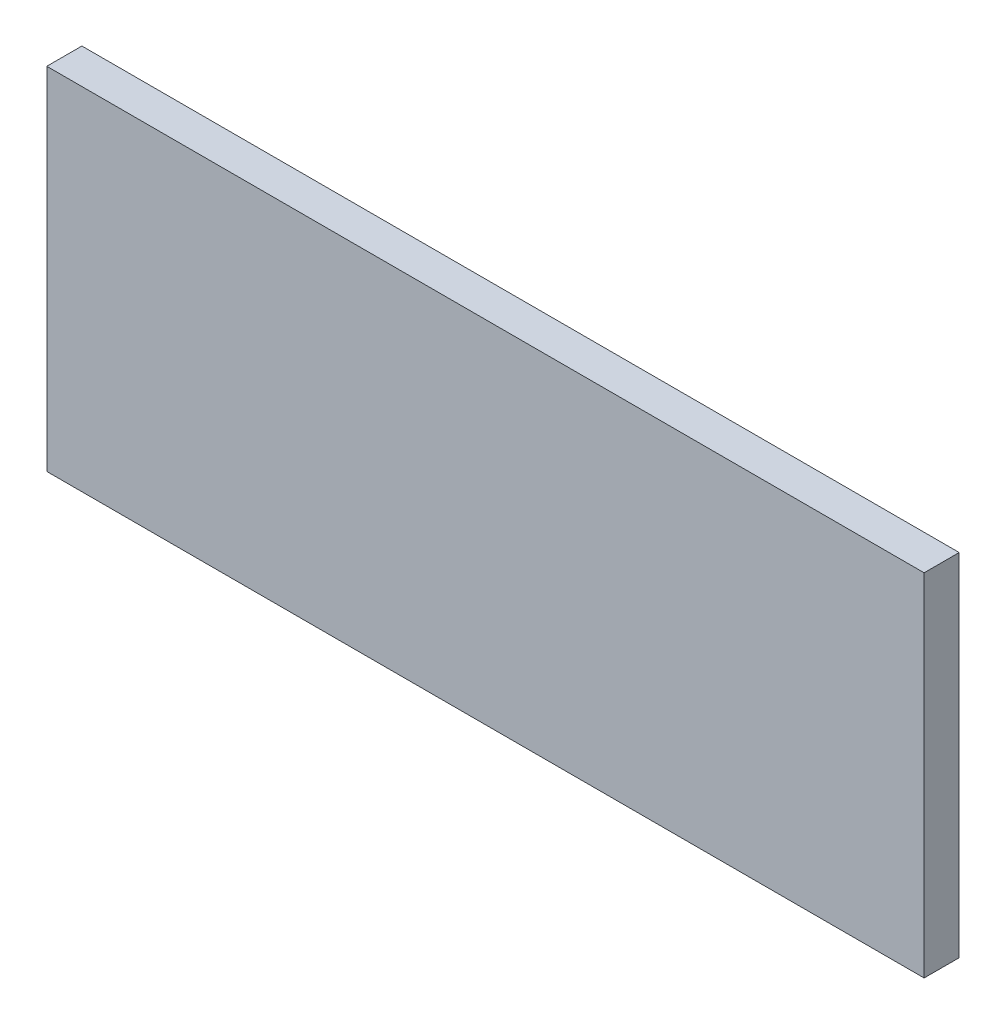
ISO-10303-21;
HEADER;
FILE_DESCRIPTION(('STEP AP214'),'2;1');
FILE_NAME('part.step','',(''),(''),'','','');
FILE_SCHEMA(('AUTOMOTIVE_DESIGN { 1 0 10303 214 1 1 1 1 }'));
ENDSEC;
DATA;
#1=APPLICATION_CONTEXT('core data for automotive mechanical design processes');
#2=APPLICATION_PROTOCOL_DEFINITION('international standard','automotive_design',2000,#1);
#3=PRODUCT_CONTEXT('',#1,'mechanical');
#4=PRODUCT('Part','Part','',(#3));
#5=PRODUCT_RELATED_PRODUCT_CATEGORY('part','',(#4));
#6=PRODUCT_DEFINITION_FORMATION('','',#4);
#7=PRODUCT_DEFINITION_CONTEXT('part definition',#1,'design');
#8=PRODUCT_DEFINITION('design','',#6,#7);
#9=PRODUCT_DEFINITION_SHAPE('','',#8);
#10=(LENGTH_UNIT() NAMED_UNIT(*) SI_UNIT(.MILLI.,.METRE.));
#11=(NAMED_UNIT(*) PLANE_ANGLE_UNIT() SI_UNIT($,.RADIAN.));
#12=(NAMED_UNIT(*) SI_UNIT($,.STERADIAN.) SOLID_ANGLE_UNIT());
#13=UNCERTAINTY_MEASURE_WITH_UNIT(LENGTH_MEASURE(1.E-05),#10,'distance_accuracy_value','');
#14=(GEOMETRIC_REPRESENTATION_CONTEXT(3) GLOBAL_UNCERTAINTY_ASSIGNED_CONTEXT((#13)) GLOBAL_UNIT_ASSIGNED_CONTEXT((#10,
#11,#12)) REPRESENTATION_CONTEXT('',''));
#15=CARTESIAN_POINT('',(0.,0.,0.));
#16=DIRECTION('',(0.,0.,1.));
#17=DIRECTION('',(1.,0.,0.));
#18=AXIS2_PLACEMENT_3D('',#15,#16,#17);
#19=CARTESIAN_POINT('',(-75.,-30.,-6.));
#20=DIRECTION('',(-1.,0.,0.));
#21=DIRECTION('',(0.,0.,1.));
#22=AXIS2_PLACEMENT_3D('',#19,#20,#21);
#23=PLANE('',#22);
#24=DIRECTION('',(0.,-1.,0.));
#25=VECTOR('',#24,1.);
#26=CARTESIAN_POINT('',(-75.,-30.,0.));
#27=LINE('',#26,#25);
#28=CARTESIAN_POINT('',(-75.,30.,0.));
#29=VERTEX_POINT('',#28);
#30=CARTESIAN_POINT('',(-75.,-30.,0.));
#31=VERTEX_POINT('',#30);
#32=EDGE_CURVE('E105',#29,#31,#27,.T.);
#33=ORIENTED_EDGE('',*,*,#32,.F.);
#34=DIRECTION('',(0.,0.,1.));
#35=VECTOR('',#34,1.);
#36=CARTESIAN_POINT('',(-75.,30.,-6.));
#37=LINE('',#36,#35);
#38=CARTESIAN_POINT('',(-75.,30.,-6.));
#39=VERTEX_POINT('',#38);
#40=EDGE_CURVE('E11',#39,#29,#37,.T.);
#41=ORIENTED_EDGE('',*,*,#40,.F.);
#42=DIRECTION('',(0.,-1.,0.));
#43=VECTOR('',#42,1.);
#44=CARTESIAN_POINT('',(-75.,-30.,-6.));
#45=LINE('',#44,#43);
#46=CARTESIAN_POINT('',(-75.,-30.,-6.));
#47=VERTEX_POINT('',#46);
#48=EDGE_CURVE('E99',#39,#47,#45,.T.);
#49=ORIENTED_EDGE('',*,*,#48,.T.);
#50=DIRECTION('',(0.,0.,1.));
#51=VECTOR('',#50,1.);
#52=CARTESIAN_POINT('',(-75.,-30.,-6.));
#53=LINE('',#52,#51);
#54=EDGE_CURVE('E44',#47,#31,#53,.T.);
#55=ORIENTED_EDGE('',*,*,#54,.T.);
#56=EDGE_LOOP('',(#33,#41,#49,#55));
#57=FACE_BOUND('',#56,.T.);
#58=ADVANCED_FACE('F41',(#57),#23,.T.);
#59=CARTESIAN_POINT('',(-75.,30.,-6.));
#60=DIRECTION('',(0.,1.,0.));
#61=DIRECTION('',(0.,0.,1.));
#62=AXIS2_PLACEMENT_3D('',#59,#60,#61);
#63=PLANE('',#62);
#64=DIRECTION('',(-1.,0.,0.));
#65=VECTOR('',#64,1.);
#66=CARTESIAN_POINT('',(-75.,30.,0.));
#67=LINE('',#66,#65);
#68=CARTESIAN_POINT('',(75.,30.,0.));
#69=VERTEX_POINT('',#68);
#70=EDGE_CURVE('E101',#69,#29,#67,.T.);
#71=ORIENTED_EDGE('',*,*,#70,.F.);
#72=DIRECTION('',(0.,0.,1.));
#73=VECTOR('',#72,1.);
#74=CARTESIAN_POINT('',(75.,30.,-6.));
#75=LINE('',#74,#73);
#76=CARTESIAN_POINT('',(75.,30.,-6.));
#77=VERTEX_POINT('',#76);
#78=EDGE_CURVE('E50',#77,#69,#75,.T.);
#79=ORIENTED_EDGE('',*,*,#78,.F.);
#80=DIRECTION('',(-1.,0.,0.));
#81=VECTOR('',#80,1.);
#82=CARTESIAN_POINT('',(-75.,30.,-6.));
#83=LINE('',#82,#81);
#84=EDGE_CURVE('E96',#77,#39,#83,.T.);
#85=ORIENTED_EDGE('',*,*,#84,.T.);
#86=ORIENTED_EDGE('',*,*,#40,.T.);
#87=EDGE_LOOP('',(#71,#79,#85,#86));
#88=FACE_BOUND('',#87,.T.);
#89=ADVANCED_FACE('F115',(#88),#63,.T.);
#90=CARTESIAN_POINT('',(75.,-30.,-6.));
#91=DIRECTION('',(1.,0.,0.));
#92=DIRECTION('',(0.,0.,-1.));
#93=AXIS2_PLACEMENT_3D('',#90,#91,#92);
#94=PLANE('',#93);
#95=DIRECTION('',(0.,1.,0.));
#96=VECTOR('',#95,1.);
#97=CARTESIAN_POINT('',(75.,-30.,0.));
#98=LINE('',#97,#96);
#99=CARTESIAN_POINT('',(75.,-30.,0.));
#100=VERTEX_POINT('',#99);
#101=EDGE_CURVE('E91',#100,#69,#98,.T.);
#102=ORIENTED_EDGE('',*,*,#101,.F.);
#103=DIRECTION('',(0.,0.,1.));
#104=VECTOR('',#103,1.);
#105=CARTESIAN_POINT('',(75.,-30.,-6.));
#106=LINE('',#105,#104);
#107=CARTESIAN_POINT('',(75.,-30.,-6.));
#108=VERTEX_POINT('',#107);
#109=EDGE_CURVE('E86',#108,#100,#106,.T.);
#110=ORIENTED_EDGE('',*,*,#109,.F.);
#111=DIRECTION('',(0.,1.,0.));
#112=VECTOR('',#111,1.);
#113=CARTESIAN_POINT('',(75.,-30.,-6.));
#114=LINE('',#113,#112);
#115=EDGE_CURVE('E89',#108,#77,#114,.T.);
#116=ORIENTED_EDGE('',*,*,#115,.T.);
#117=ORIENTED_EDGE('',*,*,#78,.T.);
#118=EDGE_LOOP('',(#102,#110,#116,#117));
#119=FACE_BOUND('',#118,.T.);
#120=ADVANCED_FACE('F88',(#119),#94,.T.);
#121=CARTESIAN_POINT('',(-75.,-30.,-6.));
#122=DIRECTION('',(0.,-1.,0.));
#123=DIRECTION('',(0.,0.,-1.));
#124=AXIS2_PLACEMENT_3D('',#121,#122,#123);
#125=PLANE('',#124);
#126=DIRECTION('',(1.,0.,0.));
#127=VECTOR('',#126,1.);
#128=CARTESIAN_POINT('',(-75.,-30.,0.));
#129=LINE('',#128,#127);
#130=EDGE_CURVE('E108',#31,#100,#129,.T.);
#131=ORIENTED_EDGE('',*,*,#130,.F.);
#132=ORIENTED_EDGE('',*,*,#54,.F.);
#133=DIRECTION('',(1.,0.,0.));
#134=VECTOR('',#133,1.);
#135=CARTESIAN_POINT('',(-75.,-30.,-6.));
#136=LINE('',#135,#134);
#137=EDGE_CURVE('E95',#47,#108,#136,.T.);
#138=ORIENTED_EDGE('',*,*,#137,.T.);
#139=ORIENTED_EDGE('',*,*,#109,.T.);
#140=EDGE_LOOP('',(#131,#132,#138,#139));
#141=FACE_BOUND('',#140,.T.);
#142=ADVANCED_FACE('F98',(#141),#125,.T.);
#143=CARTESIAN_POINT('',(0.,0.,-6.));
#144=DIRECTION('',(0.,0.,-1.));
#145=DIRECTION('',(-1.,0.,0.));
#146=AXIS2_PLACEMENT_3D('',#143,#144,#145);
#147=PLANE('',#146);
#148=ORIENTED_EDGE('',*,*,#48,.F.);
#149=ORIENTED_EDGE('',*,*,#84,.F.);
#150=ORIENTED_EDGE('',*,*,#115,.F.);
#151=ORIENTED_EDGE('',*,*,#137,.F.);
#152=EDGE_LOOP('',(#148,#149,#150,#151));
#153=FACE_BOUND('',#152,.T.);
#154=ADVANCED_FACE('F94',(#153),#147,.T.);
#155=CARTESIAN_POINT('',(0.,0.,0.));
#156=DIRECTION('',(0.,0.,-1.));
#157=DIRECTION('',(-1.,0.,0.));
#158=AXIS2_PLACEMENT_3D('',#155,#156,#157);
#159=PLANE('',#158);
#160=ORIENTED_EDGE('',*,*,#32,.T.);
#161=ORIENTED_EDGE('',*,*,#130,.T.);
#162=ORIENTED_EDGE('',*,*,#101,.T.);
#163=ORIENTED_EDGE('',*,*,#70,.T.);
#164=EDGE_LOOP('',(#160,#161,#162,#163));
#165=FACE_BOUND('',#164,.T.);
#166=ADVANCED_FACE('F114',(#165),#159,.F.);
#167=CLOSED_SHELL('',(#58,#89,#120,#142,#154,#166));
#168=MANIFOLD_SOLID_BREP('B2',#167);
#169=ADVANCED_BREP_SHAPE_REPRESENTATION('',(#18,#168),#14);
#170=SHAPE_DEFINITION_REPRESENTATION(#9,#169);
ENDSEC;
END-ISO-10303-21;
